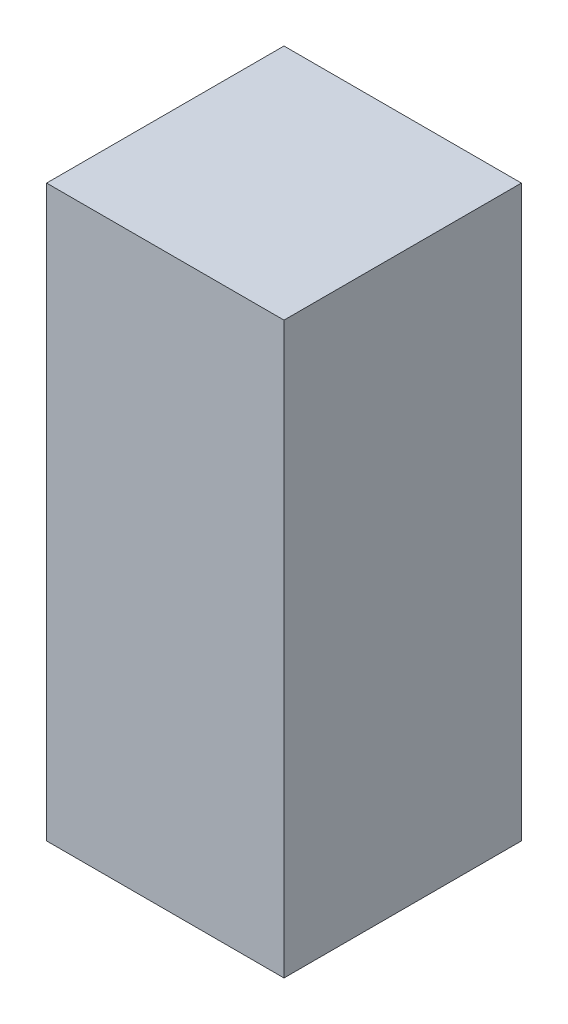
ISO-10303-21;
HEADER;
FILE_DESCRIPTION(('STEP AP214'),'2;1');
FILE_NAME('part.step','',(''),(''),'','','');
FILE_SCHEMA(('AUTOMOTIVE_DESIGN { 1 0 10303 214 1 1 1 1 }'));
ENDSEC;
DATA;
#1=APPLICATION_CONTEXT('core data for automotive mechanical design processes');
#2=APPLICATION_PROTOCOL_DEFINITION('international standard','automotive_design',2000,#1);
#3=PRODUCT_CONTEXT('',#1,'mechanical');
#4=PRODUCT('Part','Part','',(#3));
#5=PRODUCT_RELATED_PRODUCT_CATEGORY('part','',(#4));
#6=PRODUCT_DEFINITION_FORMATION('','',#4);
#7=PRODUCT_DEFINITION_CONTEXT('part definition',#1,'design');
#8=PRODUCT_DEFINITION('design','',#6,#7);
#9=PRODUCT_DEFINITION_SHAPE('','',#8);
#10=(LENGTH_UNIT() NAMED_UNIT(*) SI_UNIT(.MILLI.,.METRE.));
#11=(NAMED_UNIT(*) PLANE_ANGLE_UNIT() SI_UNIT($,.RADIAN.));
#12=(NAMED_UNIT(*) SI_UNIT($,.STERADIAN.) SOLID_ANGLE_UNIT());
#13=UNCERTAINTY_MEASURE_WITH_UNIT(LENGTH_MEASURE(1.E-05),#10,'distance_accuracy_value','');
#14=(GEOMETRIC_REPRESENTATION_CONTEXT(3) GLOBAL_UNCERTAINTY_ASSIGNED_CONTEXT((#13)) GLOBAL_UNIT_ASSIGNED_CONTEXT((#10,
#11,#12)) REPRESENTATION_CONTEXT('',''));
#15=CARTESIAN_POINT('',(0.,0.,0.));
#16=DIRECTION('',(0.,0.,1.));
#17=DIRECTION('',(1.,0.,0.));
#18=AXIS2_PLACEMENT_3D('',#15,#16,#17);
#19=CARTESIAN_POINT('',(2.5,6.,2.5));
#20=DIRECTION('',(-1.,0.,0.));
#21=DIRECTION('',(0.,0.,1.));
#22=AXIS2_PLACEMENT_3D('',#19,#20,#21);
#23=PLANE('',#22);
#24=DIRECTION('',(0.,0.,-1.));
#25=VECTOR('',#24,1.);
#26=CARTESIAN_POINT('',(2.5,-6.,2.5));
#27=LINE('',#26,#25);
#28=CARTESIAN_POINT('',(2.5,-6.,2.5));
#29=VERTEX_POINT('',#28);
#30=CARTESIAN_POINT('',(2.5,-6.,-2.5));
#31=VERTEX_POINT('',#30);
#32=EDGE_CURVE('E98',#29,#31,#27,.T.);
#33=ORIENTED_EDGE('',*,*,#32,.T.);
#34=DIRECTION('',(0.,-1.,0.));
#35=VECTOR('',#34,1.);
#36=CARTESIAN_POINT('',(2.5,6.,-2.5));
#37=LINE('',#36,#35);
#38=CARTESIAN_POINT('',(2.5,6.,-2.5));
#39=VERTEX_POINT('',#38);
#40=EDGE_CURVE('E11',#39,#31,#37,.T.);
#41=ORIENTED_EDGE('',*,*,#40,.F.);
#42=DIRECTION('',(0.,0.,-1.));
#43=VECTOR('',#42,1.);
#44=CARTESIAN_POINT('',(2.5,6.,2.5));
#45=LINE('',#44,#43);
#46=CARTESIAN_POINT('',(2.5,6.,2.5));
#47=VERTEX_POINT('',#46);
#48=EDGE_CURVE('E86',#47,#39,#45,.T.);
#49=ORIENTED_EDGE('',*,*,#48,.F.);
#50=DIRECTION('',(0.,-1.,0.));
#51=VECTOR('',#50,1.);
#52=CARTESIAN_POINT('',(2.5,6.,2.5));
#53=LINE('',#52,#51);
#54=EDGE_CURVE('E94',#47,#29,#53,.T.);
#55=ORIENTED_EDGE('',*,*,#54,.T.);
#56=EDGE_LOOP('',(#33,#41,#49,#55));
#57=FACE_BOUND('',#56,.T.);
#58=ADVANCED_FACE('F35',(#57),#23,.F.);
#59=CARTESIAN_POINT('',(-2.5,6.,-2.5));
#60=DIRECTION('',(0.,0.,1.));
#61=DIRECTION('',(1.,0.,0.));
#62=AXIS2_PLACEMENT_3D('',#59,#60,#61);
#63=PLANE('',#62);
#64=DIRECTION('',(-1.,0.,0.));
#65=VECTOR('',#64,1.);
#66=CARTESIAN_POINT('',(-2.5,-6.,-2.5));
#67=LINE('',#66,#65);
#68=CARTESIAN_POINT('',(-2.5,-6.,-2.5));
#69=VERTEX_POINT('',#68);
#70=EDGE_CURVE('E90',#31,#69,#67,.T.);
#71=ORIENTED_EDGE('',*,*,#70,.T.);
#72=DIRECTION('',(0.,-1.,0.));
#73=VECTOR('',#72,1.);
#74=CARTESIAN_POINT('',(-2.5,6.,-2.5));
#75=LINE('',#74,#73);
#76=CARTESIAN_POINT('',(-2.5,6.,-2.5));
#77=VERTEX_POINT('',#76);
#78=EDGE_CURVE('E43',#77,#69,#75,.T.);
#79=ORIENTED_EDGE('',*,*,#78,.F.);
#80=DIRECTION('',(-1.,0.,0.));
#81=VECTOR('',#80,1.);
#82=CARTESIAN_POINT('',(-2.5,6.,-2.5));
#83=LINE('',#82,#81);
#84=EDGE_CURVE('E81',#39,#77,#83,.T.);
#85=ORIENTED_EDGE('',*,*,#84,.F.);
#86=ORIENTED_EDGE('',*,*,#40,.T.);
#87=EDGE_LOOP('',(#71,#79,#85,#86));
#88=FACE_BOUND('',#87,.T.);
#89=ADVANCED_FACE('F89',(#88),#63,.F.);
#90=CARTESIAN_POINT('',(-2.5,6.,2.5));
#91=DIRECTION('',(1.,0.,0.));
#92=DIRECTION('',(0.,0.,-1.));
#93=AXIS2_PLACEMENT_3D('',#90,#91,#92);
#94=PLANE('',#93);
#95=DIRECTION('',(0.,0.,1.));
#96=VECTOR('',#95,1.);
#97=CARTESIAN_POINT('',(-2.5,-6.,2.5));
#98=LINE('',#97,#96);
#99=CARTESIAN_POINT('',(-2.5,-6.,2.5));
#100=VERTEX_POINT('',#99);
#101=EDGE_CURVE('E68',#69,#100,#98,.T.);
#102=ORIENTED_EDGE('',*,*,#101,.T.);
#103=DIRECTION('',(0.,-1.,0.));
#104=VECTOR('',#103,1.);
#105=CARTESIAN_POINT('',(-2.5,6.,2.5));
#106=LINE('',#105,#104);
#107=CARTESIAN_POINT('',(-2.5,6.,2.5));
#108=VERTEX_POINT('',#107);
#109=EDGE_CURVE('E91',#108,#100,#106,.T.);
#110=ORIENTED_EDGE('',*,*,#109,.F.);
#111=DIRECTION('',(0.,0.,1.));
#112=VECTOR('',#111,1.);
#113=CARTESIAN_POINT('',(-2.5,6.,2.5));
#114=LINE('',#113,#112);
#115=EDGE_CURVE('E84',#77,#108,#114,.T.);
#116=ORIENTED_EDGE('',*,*,#115,.F.);
#117=ORIENTED_EDGE('',*,*,#78,.T.);
#118=EDGE_LOOP('',(#102,#110,#116,#117));
#119=FACE_BOUND('',#118,.T.);
#120=ADVANCED_FACE('F92',(#119),#94,.F.);
#121=CARTESIAN_POINT('',(-2.5,6.,2.5));
#122=DIRECTION('',(0.,0.,-1.));
#123=DIRECTION('',(-1.,0.,0.));
#124=AXIS2_PLACEMENT_3D('',#121,#122,#123);
#125=PLANE('',#124);
#126=DIRECTION('',(1.,0.,0.));
#127=VECTOR('',#126,1.);
#128=CARTESIAN_POINT('',(-2.5,-6.,2.5));
#129=LINE('',#128,#127);
#130=EDGE_CURVE('E74',#100,#29,#129,.T.);
#131=ORIENTED_EDGE('',*,*,#130,.T.);
#132=ORIENTED_EDGE('',*,*,#54,.F.);
#133=DIRECTION('',(1.,0.,0.));
#134=VECTOR('',#133,1.);
#135=CARTESIAN_POINT('',(-2.5,6.,2.5));
#136=LINE('',#135,#134);
#137=EDGE_CURVE('E51',#108,#47,#136,.T.);
#138=ORIENTED_EDGE('',*,*,#137,.F.);
#139=ORIENTED_EDGE('',*,*,#109,.T.);
#140=EDGE_LOOP('',(#131,#132,#138,#139));
#141=FACE_BOUND('',#140,.T.);
#142=ADVANCED_FACE('F105',(#141),#125,.F.);
#143=CARTESIAN_POINT('',(0.,6.,0.));
#144=DIRECTION('',(0.,-1.,0.));
#145=DIRECTION('',(0.,0.,-1.));
#146=AXIS2_PLACEMENT_3D('',#143,#144,#145);
#147=PLANE('',#146);
#148=ORIENTED_EDGE('',*,*,#48,.T.);
#149=ORIENTED_EDGE('',*,*,#84,.T.);
#150=ORIENTED_EDGE('',*,*,#115,.T.);
#151=ORIENTED_EDGE('',*,*,#137,.T.);
#152=EDGE_LOOP('',(#148,#149,#150,#151));
#153=FACE_BOUND('',#152,.T.);
#154=ADVANCED_FACE('F82',(#153),#147,.F.);
#155=CARTESIAN_POINT('',(0.,-6.,0.));
#156=DIRECTION('',(0.,-1.,0.));
#157=DIRECTION('',(0.,0.,-1.));
#158=AXIS2_PLACEMENT_3D('',#155,#156,#157);
#159=PLANE('',#158);
#160=ORIENTED_EDGE('',*,*,#32,.F.);
#161=ORIENTED_EDGE('',*,*,#130,.F.);
#162=ORIENTED_EDGE('',*,*,#101,.F.);
#163=ORIENTED_EDGE('',*,*,#70,.F.);
#164=EDGE_LOOP('',(#160,#161,#162,#163));
#165=FACE_BOUND('',#164,.T.);
#166=ADVANCED_FACE('F108',(#165),#159,.T.);
#167=CLOSED_SHELL('',(#58,#89,#120,#142,#154,#166));
#168=MANIFOLD_SOLID_BREP('B2',#167);
#169=ADVANCED_BREP_SHAPE_REPRESENTATION('',(#18,#168),#14);
#170=SHAPE_DEFINITION_REPRESENTATION(#9,#169);
ENDSEC;
END-ISO-10303-21;
